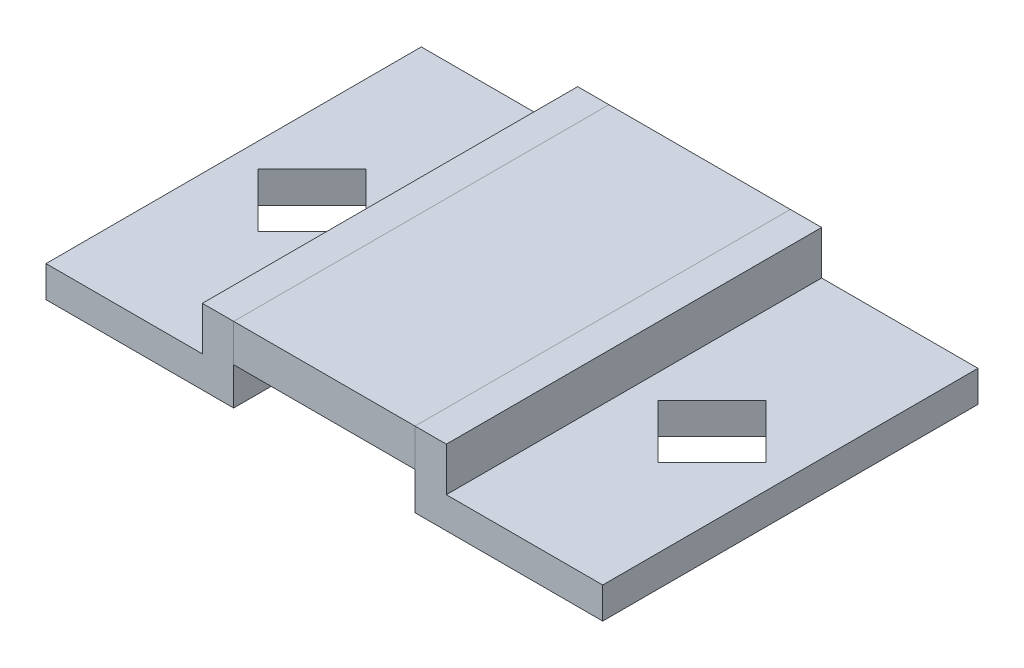
ISO-10303-21;
HEADER;
FILE_DESCRIPTION(('STEP AP214'),'2;1');
FILE_NAME('part.step','',(''),(''),'','','');
FILE_SCHEMA(('AUTOMOTIVE_DESIGN { 1 0 10303 214 1 1 1 1 }'));
ENDSEC;
DATA;
#1=APPLICATION_CONTEXT('core data for automotive mechanical design processes');
#2=APPLICATION_PROTOCOL_DEFINITION('international standard','automotive_design',2000,#1);
#3=PRODUCT_CONTEXT('',#1,'mechanical');
#4=PRODUCT('Part','Part','',(#3));
#5=PRODUCT_RELATED_PRODUCT_CATEGORY('part','',(#4));
#6=PRODUCT_DEFINITION_FORMATION('','',#4);
#7=PRODUCT_DEFINITION_CONTEXT('part definition',#1,'design');
#8=PRODUCT_DEFINITION('design','',#6,#7);
#9=PRODUCT_DEFINITION_SHAPE('','',#8);
#10=(LENGTH_UNIT() NAMED_UNIT(*) SI_UNIT(.MILLI.,.METRE.));
#11=(NAMED_UNIT(*) PLANE_ANGLE_UNIT() SI_UNIT($,.RADIAN.));
#12=(NAMED_UNIT(*) SI_UNIT($,.STERADIAN.) SOLID_ANGLE_UNIT());
#13=UNCERTAINTY_MEASURE_WITH_UNIT(LENGTH_MEASURE(1.E-05),#10,'distance_accuracy_value','');
#14=(GEOMETRIC_REPRESENTATION_CONTEXT(3) GLOBAL_UNCERTAINTY_ASSIGNED_CONTEXT((#13)) GLOBAL_UNIT_ASSIGNED_CONTEXT((#10,
#11,#12)) REPRESENTATION_CONTEXT('',''));
#15=CARTESIAN_POINT('',(0.,0.,0.));
#16=DIRECTION('',(0.,0.,1.));
#17=DIRECTION('',(1.,0.,0.));
#18=AXIS2_PLACEMENT_3D('',#15,#16,#17);
#19=CARTESIAN_POINT('',(17.,-3.,-30.));
#20=DIRECTION('',(1.,0.,0.));
#21=DIRECTION('',(0.,0.,-1.));
#22=AXIS2_PLACEMENT_3D('',#19,#20,#21);
#23=PLANE('',#22);
#24=DIRECTION('',(0.,1.,0.));
#25=VECTOR('',#24,1.);
#26=CARTESIAN_POINT('',(17.,-3.,0.));
#27=LINE('',#26,#25);
#28=CARTESIAN_POINT('',(17.,-0.5,0.));
#29=VERTEX_POINT('',#28);
#30=CARTESIAN_POINT('',(17.,3.,0.));
#31=VERTEX_POINT('',#30);
#32=EDGE_CURVE('E193',#29,#31,#27,.T.);
#33=ORIENTED_EDGE('',*,*,#32,.F.);
#34=DIRECTION('',(0.,0.,-1.));
#35=VECTOR('',#34,1.);
#36=CARTESIAN_POINT('',(17.,-0.5,-30.));
#37=LINE('',#36,#35);
#38=CARTESIAN_POINT('',(17.,-0.5,-30.));
#39=VERTEX_POINT('',#38);
#40=EDGE_CURVE('E179',#29,#39,#37,.T.);
#41=ORIENTED_EDGE('',*,*,#40,.T.);
#42=DIRECTION('',(0.,1.,0.));
#43=VECTOR('',#42,1.);
#44=CARTESIAN_POINT('',(17.,-3.,-30.));
#45=LINE('',#44,#43);
#46=CARTESIAN_POINT('',(17.,3.,-30.));
#47=VERTEX_POINT('',#46);
#48=EDGE_CURVE('E195',#39,#47,#45,.T.);
#49=ORIENTED_EDGE('',*,*,#48,.T.);
#50=DIRECTION('',(0.,0.,-1.));
#51=VECTOR('',#50,1.);
#52=CARTESIAN_POINT('',(17.,3.,-30.));
#53=LINE('',#52,#51);
#54=EDGE_CURVE('E201',#31,#47,#53,.T.);
#55=ORIENTED_EDGE('',*,*,#54,.F.);
#56=EDGE_LOOP('',(#33,#41,#49,#55));
#57=FACE_BOUND('',#56,.T.);
#58=ADVANCED_FACE('F54',(#57),#23,.T.);
#59=CARTESIAN_POINT('',(14.5,-3.,-30.));
#60=DIRECTION('',(-1.,0.,0.));
#61=DIRECTION('',(0.,0.,1.));
#62=AXIS2_PLACEMENT_3D('',#59,#60,#61);
#63=PLANE('',#62);
#64=DIRECTION('',(0.,0.,1.));
#65=VECTOR('',#64,1.);
#66=CARTESIAN_POINT('',(14.5,3.,-30.));
#67=LINE('',#66,#65);
#68=CARTESIAN_POINT('',(14.5,3.,-30.));
#69=VERTEX_POINT('',#68);
#70=CARTESIAN_POINT('',(14.5,3.,0.));
#71=VERTEX_POINT('',#70);
#72=EDGE_CURVE('E12',#69,#71,#67,.T.);
#73=ORIENTED_EDGE('',*,*,#72,.F.);
#74=DIRECTION('',(0.,1.,0.));
#75=VECTOR('',#74,1.);
#76=CARTESIAN_POINT('',(14.5,-3.,-30.));
#77=LINE('',#76,#75);
#78=CARTESIAN_POINT('',(14.5,-3.,-30.));
#79=VERTEX_POINT('',#78);
#80=EDGE_CURVE('E178',#79,#69,#77,.T.);
#81=ORIENTED_EDGE('',*,*,#80,.F.);
#82=DIRECTION('',(0.,0.,1.));
#83=VECTOR('',#82,1.);
#84=CARTESIAN_POINT('',(14.5,-3.,-30.));
#85=LINE('',#84,#83);
#86=CARTESIAN_POINT('',(14.5,-3.,0.));
#87=VERTEX_POINT('',#86);
#88=EDGE_CURVE('E58',#79,#87,#85,.T.);
#89=ORIENTED_EDGE('',*,*,#88,.T.);
#90=DIRECTION('',(0.,1.,0.));
#91=VECTOR('',#90,1.);
#92=CARTESIAN_POINT('',(14.5,-3.,0.));
#93=LINE('',#92,#91);
#94=EDGE_CURVE('E190',#87,#71,#93,.T.);
#95=ORIENTED_EDGE('',*,*,#94,.T.);
#96=EDGE_LOOP('',(#73,#81,#89,#95));
#97=FACE_BOUND('',#96,.T.);
#98=ADVANCED_FACE('F214',(#97),#63,.T.);
#99=CARTESIAN_POINT('',(14.5,-3.,-30.));
#100=DIRECTION('',(0.,0.,-1.));
#101=DIRECTION('',(-1.,0.,0.));
#102=AXIS2_PLACEMENT_3D('',#99,#100,#101);
#103=PLANE('',#102);
#104=DIRECTION('',(-1.,0.,0.));
#105=VECTOR('',#104,1.);
#106=CARTESIAN_POINT('',(14.5,3.,-30.));
#107=LINE('',#106,#105);
#108=EDGE_CURVE('E198',#47,#69,#107,.T.);
#109=ORIENTED_EDGE('',*,*,#108,.F.);
#110=ORIENTED_EDGE('',*,*,#48,.F.);
#111=DIRECTION('',(1.,0.,0.));
#112=VECTOR('',#111,1.);
#113=CARTESIAN_POINT('',(17.,-0.5,-30.));
#114=LINE('',#113,#112);
#115=CARTESIAN_POINT('',(29.5,-0.5,-30.));
#116=VERTEX_POINT('',#115);
#117=EDGE_CURVE('E185',#39,#116,#114,.T.);
#118=ORIENTED_EDGE('',*,*,#117,.T.);
#119=DIRECTION('',(0.,-1.,0.));
#120=VECTOR('',#119,1.);
#121=CARTESIAN_POINT('',(29.5,-0.5,-30.));
#122=LINE('',#121,#120);
#123=CARTESIAN_POINT('',(29.5,-3.,-30.));
#124=VERTEX_POINT('',#123);
#125=EDGE_CURVE('E169',#116,#124,#122,.T.);
#126=ORIENTED_EDGE('',*,*,#125,.T.);
#127=DIRECTION('',(-1.,0.,0.));
#128=VECTOR('',#127,1.);
#129=CARTESIAN_POINT('',(14.5,-3.,-30.));
#130=LINE('',#129,#128);
#131=EDGE_CURVE('E192',#124,#79,#130,.T.);
#132=ORIENTED_EDGE('',*,*,#131,.T.);
#133=ORIENTED_EDGE('',*,*,#80,.T.);
#134=EDGE_LOOP('',(#109,#110,#118,#126,#132,#133));
#135=FACE_BOUND('',#134,.T.);
#136=ADVANCED_FACE('F218',(#135),#103,.T.);
#137=CARTESIAN_POINT('',(14.5,-3.,0.));
#138=DIRECTION('',(0.,0.,1.));
#139=DIRECTION('',(1.,0.,0.));
#140=AXIS2_PLACEMENT_3D('',#137,#138,#139);
#141=PLANE('',#140);
#142=DIRECTION('',(1.,0.,0.));
#143=VECTOR('',#142,1.);
#144=CARTESIAN_POINT('',(14.5,3.,0.));
#145=LINE('',#144,#143);
#146=EDGE_CURVE('E63',#71,#31,#145,.T.);
#147=ORIENTED_EDGE('',*,*,#146,.F.);
#148=ORIENTED_EDGE('',*,*,#94,.F.);
#149=DIRECTION('',(1.,0.,0.));
#150=VECTOR('',#149,1.);
#151=CARTESIAN_POINT('',(14.5,-3.,0.));
#152=LINE('',#151,#150);
#153=CARTESIAN_POINT('',(29.5,-3.,0.));
#154=VERTEX_POINT('',#153);
#155=EDGE_CURVE('E207',#87,#154,#152,.T.);
#156=ORIENTED_EDGE('',*,*,#155,.T.);
#157=DIRECTION('',(0.,-1.,0.));
#158=VECTOR('',#157,1.);
#159=CARTESIAN_POINT('',(29.5,-0.5,0.));
#160=LINE('',#159,#158);
#161=CARTESIAN_POINT('',(29.5,-0.5,0.));
#162=VERTEX_POINT('',#161);
#163=EDGE_CURVE('E165',#162,#154,#160,.T.);
#164=ORIENTED_EDGE('',*,*,#163,.F.);
#165=DIRECTION('',(-1.,0.,0.));
#166=VECTOR('',#165,1.);
#167=CARTESIAN_POINT('',(17.,-0.5,0.));
#168=LINE('',#167,#166);
#169=EDGE_CURVE('E172',#162,#29,#168,.T.);
#170=ORIENTED_EDGE('',*,*,#169,.T.);
#171=ORIENTED_EDGE('',*,*,#32,.T.);
#172=EDGE_LOOP('',(#147,#148,#156,#164,#170,#171));
#173=FACE_BOUND('',#172,.T.);
#174=ADVANCED_FACE('F225',(#173),#141,.T.);
#175=CARTESIAN_POINT('',(0.,-3.,0.));
#176=DIRECTION('',(0.,1.,0.));
#177=DIRECTION('',(0.,0.,1.));
#178=AXIS2_PLACEMENT_3D('',#175,#176,#177);
#179=PLANE('',#178);
#180=DIRECTION('',(0.707106781186548,0.,0.707106781186547));
#181=VECTOR('',#180,1.);
#182=CARTESIAN_POINT('',(23.25,-3.,-10.6866486347621));
#183=LINE('',#182,#181);
#184=CARTESIAN_POINT('',(18.9366486347621,-3.,-15.));
#185=VERTEX_POINT('',#184);
#186=CARTESIAN_POINT('',(23.25,-3.,-10.6866486347621));
#187=VERTEX_POINT('',#186);
#188=EDGE_CURVE('E141',#185,#187,#183,.T.);
#189=ORIENTED_EDGE('',*,*,#188,.T.);
#190=DIRECTION('',(0.707106781186547,0.,-0.707106781186548));
#191=VECTOR('',#190,1.);
#192=CARTESIAN_POINT('',(27.5633513652379,-3.,-15.));
#193=LINE('',#192,#191);
#194=CARTESIAN_POINT('',(27.5633513652379,-3.,-15.));
#195=VERTEX_POINT('',#194);
#196=EDGE_CURVE('E135',#187,#195,#193,.T.);
#197=ORIENTED_EDGE('',*,*,#196,.T.);
#198=DIRECTION('',(-0.707106781186548,0.,-0.707106781186547));
#199=VECTOR('',#198,1.);
#200=CARTESIAN_POINT('',(23.25,-3.,-19.3133513652379));
#201=LINE('',#200,#199);
#202=CARTESIAN_POINT('',(23.25,-3.,-19.3133513652379));
#203=VERTEX_POINT('',#202);
#204=EDGE_CURVE('E144',#195,#203,#201,.T.);
#205=ORIENTED_EDGE('',*,*,#204,.T.);
#206=DIRECTION('',(-0.707106781186547,0.,0.707106781186547));
#207=VECTOR('',#206,1.);
#208=CARTESIAN_POINT('',(18.9366486347621,-3.,-15.));
#209=LINE('',#208,#207);
#210=EDGE_CURVE('E71',#203,#185,#209,.T.);
#211=ORIENTED_EDGE('',*,*,#210,.T.);
#212=EDGE_LOOP('',(#189,#197,#205,#211));
#213=FACE_BOUND('',#212,.T.);
#214=ORIENTED_EDGE('',*,*,#88,.F.);
#215=ORIENTED_EDGE('',*,*,#131,.F.);
#216=DIRECTION('',(0.,0.,1.));
#217=VECTOR('',#216,1.);
#218=CARTESIAN_POINT('',(29.5,-3.,-30.));
#219=LINE('',#218,#217);
#220=EDGE_CURVE('E175',#124,#154,#219,.T.);
#221=ORIENTED_EDGE('',*,*,#220,.T.);
#222=ORIENTED_EDGE('',*,*,#155,.F.);
#223=EDGE_LOOP('',(#214,#215,#221,#222));
#224=FACE_BOUND('',#223,.T.);
#225=ADVANCED_FACE('F56',(#213,#224),#179,.F.);
#226=CARTESIAN_POINT('',(0.,3.,0.));
#227=DIRECTION('',(0.,1.,0.));
#228=DIRECTION('',(0.,0.,1.));
#229=AXIS2_PLACEMENT_3D('',#226,#227,#228);
#230=PLANE('',#229);
#231=ORIENTED_EDGE('',*,*,#72,.T.);
#232=ORIENTED_EDGE('',*,*,#146,.T.);
#233=ORIENTED_EDGE('',*,*,#54,.T.);
#234=ORIENTED_EDGE('',*,*,#108,.T.);
#235=EDGE_LOOP('',(#231,#232,#233,#234));
#236=FACE_BOUND('',#235,.T.);
#237=ADVANCED_FACE('F231',(#236),#230,.T.);
#238=CARTESIAN_POINT('',(29.5,-0.5,-30.));
#239=DIRECTION('',(1.,0.,0.));
#240=DIRECTION('',(0.,0.,-1.));
#241=AXIS2_PLACEMENT_3D('',#238,#239,#240);
#242=PLANE('',#241);
#243=ORIENTED_EDGE('',*,*,#220,.F.);
#244=ORIENTED_EDGE('',*,*,#125,.F.);
#245=DIRECTION('',(0.,0.,1.));
#246=VECTOR('',#245,1.);
#247=CARTESIAN_POINT('',(29.5,-0.5,-30.));
#248=LINE('',#247,#246);
#249=EDGE_CURVE('E182',#116,#162,#248,.T.);
#250=ORIENTED_EDGE('',*,*,#249,.T.);
#251=ORIENTED_EDGE('',*,*,#163,.T.);
#252=EDGE_LOOP('',(#243,#244,#250,#251));
#253=FACE_BOUND('',#252,.T.);
#254=ADVANCED_FACE('F223',(#253),#242,.T.);
#255=CARTESIAN_POINT('',(0.,-0.5,0.));
#256=DIRECTION('',(0.,1.,0.));
#257=DIRECTION('',(0.,0.,1.));
#258=AXIS2_PLACEMENT_3D('',#255,#256,#257);
#259=PLANE('',#258);
#260=DIRECTION('',(0.707106781186547,0.,-0.707106781186548));
#261=VECTOR('',#260,1.);
#262=CARTESIAN_POINT('',(27.5633513652379,-0.5,-15.));
#263=LINE('',#262,#261);
#264=CARTESIAN_POINT('',(23.25,-0.5,-10.6866486347621));
#265=VERTEX_POINT('',#264);
#266=CARTESIAN_POINT('',(27.5633513652379,-0.5,-15.));
#267=VERTEX_POINT('',#266);
#268=EDGE_CURVE('E79',#265,#267,#263,.T.);
#269=ORIENTED_EDGE('',*,*,#268,.F.);
#270=DIRECTION('',(0.707106781186548,0.,0.707106781186547));
#271=VECTOR('',#270,1.);
#272=CARTESIAN_POINT('',(23.25,-0.5,-10.6866486347621));
#273=LINE('',#272,#271);
#274=CARTESIAN_POINT('',(18.9366486347621,-0.5,-15.));
#275=VERTEX_POINT('',#274);
#276=EDGE_CURVE('E150',#275,#265,#273,.T.);
#277=ORIENTED_EDGE('',*,*,#276,.F.);
#278=DIRECTION('',(-0.707106781186547,0.,0.707106781186547));
#279=VECTOR('',#278,1.);
#280=CARTESIAN_POINT('',(18.9366486347621,-0.5,-15.));
#281=LINE('',#280,#279);
#282=CARTESIAN_POINT('',(23.25,-0.5,-19.3133513652379));
#283=VERTEX_POINT('',#282);
#284=EDGE_CURVE('E153',#283,#275,#281,.T.);
#285=ORIENTED_EDGE('',*,*,#284,.F.);
#286=DIRECTION('',(-0.707106781186548,0.,-0.707106781186547));
#287=VECTOR('',#286,1.);
#288=CARTESIAN_POINT('',(23.25,-0.5,-19.3133513652379));
#289=LINE('',#288,#287);
#290=EDGE_CURVE('E159',#267,#283,#289,.T.);
#291=ORIENTED_EDGE('',*,*,#290,.F.);
#292=EDGE_LOOP('',(#269,#277,#285,#291));
#293=FACE_BOUND('',#292,.T.);
#294=ORIENTED_EDGE('',*,*,#40,.F.);
#295=ORIENTED_EDGE('',*,*,#169,.F.);
#296=ORIENTED_EDGE('',*,*,#249,.F.);
#297=ORIENTED_EDGE('',*,*,#117,.F.);
#298=EDGE_LOOP('',(#294,#295,#296,#297));
#299=FACE_BOUND('',#298,.T.);
#300=ADVANCED_FACE('F238',(#293,#299),#259,.T.);
#301=CARTESIAN_POINT('',(27.5633513652379,-3.,-15.));
#302=DIRECTION('',(0.707106781186548,0.,0.707106781186547));
#303=DIRECTION('',(0.707106781186547,0.,-0.707106781186548));
#304=AXIS2_PLACEMENT_3D('',#301,#302,#303);
#305=PLANE('',#304);
#306=ORIENTED_EDGE('',*,*,#268,.T.);
#307=DIRECTION('',(0.,1.,0.));
#308=VECTOR('',#307,1.);
#309=CARTESIAN_POINT('',(27.5633513652379,-3.,-15.));
#310=LINE('',#309,#308);
#311=EDGE_CURVE('E131',#195,#267,#310,.T.);
#312=ORIENTED_EDGE('',*,*,#311,.F.);
#313=ORIENTED_EDGE('',*,*,#196,.F.);
#314=DIRECTION('',(0.,1.,0.));
#315=VECTOR('',#314,1.);
#316=CARTESIAN_POINT('',(23.25,-3.,-10.6866486347621));
#317=LINE('',#316,#315);
#318=EDGE_CURVE('E163',#187,#265,#317,.T.);
#319=ORIENTED_EDGE('',*,*,#318,.T.);
#320=EDGE_LOOP('',(#306,#312,#313,#319));
#321=FACE_BOUND('',#320,.T.);
#322=ADVANCED_FACE('F133',(#321),#305,.F.);
#323=CARTESIAN_POINT('',(23.25,-3.,-10.6866486347621));
#324=DIRECTION('',(-0.707106781186547,0.,0.707106781186548));
#325=DIRECTION('',(0.707106781186548,0.,0.707106781186547));
#326=AXIS2_PLACEMENT_3D('',#323,#324,#325);
#327=PLANE('',#326);
#328=ORIENTED_EDGE('',*,*,#276,.T.);
#329=ORIENTED_EDGE('',*,*,#318,.F.);
#330=ORIENTED_EDGE('',*,*,#188,.F.);
#331=DIRECTION('',(0.,1.,0.));
#332=VECTOR('',#331,1.);
#333=CARTESIAN_POINT('',(18.9366486347621,-3.,-15.));
#334=LINE('',#333,#332);
#335=EDGE_CURVE('E166',#185,#275,#334,.T.);
#336=ORIENTED_EDGE('',*,*,#335,.T.);
#337=EDGE_LOOP('',(#328,#329,#330,#336));
#338=FACE_BOUND('',#337,.T.);
#339=ADVANCED_FACE('F278',(#338),#327,.F.);
#340=CARTESIAN_POINT('',(18.9366486347621,-3.,-15.));
#341=DIRECTION('',(-0.707106781186548,0.,-0.707106781186548));
#342=DIRECTION('',(-0.707106781186548,0.,0.707106781186548));
#343=AXIS2_PLACEMENT_3D('',#340,#341,#342);
#344=PLANE('',#343);
#345=ORIENTED_EDGE('',*,*,#284,.T.);
#346=ORIENTED_EDGE('',*,*,#335,.F.);
#347=ORIENTED_EDGE('',*,*,#210,.F.);
#348=DIRECTION('',(0.,1.,0.));
#349=VECTOR('',#348,1.);
#350=CARTESIAN_POINT('',(23.25,-3.,-19.3133513652379));
#351=LINE('',#350,#349);
#352=EDGE_CURVE('E140',#203,#283,#351,.T.);
#353=ORIENTED_EDGE('',*,*,#352,.T.);
#354=EDGE_LOOP('',(#345,#346,#347,#353));
#355=FACE_BOUND('',#354,.T.);
#356=ADVANCED_FACE('F286',(#355),#344,.F.);
#357=CARTESIAN_POINT('',(23.25,-3.,-19.3133513652379));
#358=DIRECTION('',(0.707106781186547,0.,-0.707106781186548));
#359=DIRECTION('',(-0.707106781186548,0.,-0.707106781186547));
#360=AXIS2_PLACEMENT_3D('',#357,#358,#359);
#361=PLANE('',#360);
#362=ORIENTED_EDGE('',*,*,#290,.T.);
#363=ORIENTED_EDGE('',*,*,#352,.F.);
#364=ORIENTED_EDGE('',*,*,#204,.F.);
#365=ORIENTED_EDGE('',*,*,#311,.T.);
#366=EDGE_LOOP('',(#362,#363,#364,#365));
#367=FACE_BOUND('',#366,.T.);
#368=ADVANCED_FACE('F145',(#367),#361,.F.);
#369=CLOSED_SHELL('',(#58,#98,#136,#174,#225,#237,#254,#300,#322,#339,#356,#368));
#370=MANIFOLD_SOLID_BREP('B2',#369);
#371=CARTESIAN_POINT('',(-2.5,-3.,-30.));
#372=DIRECTION('',(-1.,0.,0.));
#373=DIRECTION('',(0.,0.,1.));
#374=AXIS2_PLACEMENT_3D('',#371,#372,#373);
#375=PLANE('',#374);
#376=DIRECTION('',(0.,1.,0.));
#377=VECTOR('',#376,1.);
#378=CARTESIAN_POINT('',(-2.5,-3.,-30.));
#379=LINE('',#378,#377);
#380=CARTESIAN_POINT('',(-2.5,-0.5,-30.));
#381=VERTEX_POINT('',#380);
#382=CARTESIAN_POINT('',(-2.5,3.,-30.));
#383=VERTEX_POINT('',#382);
#384=EDGE_CURVE('E506',#381,#383,#379,.T.);
#385=ORIENTED_EDGE('',*,*,#384,.F.);
#386=DIRECTION('',(0.,0.,1.));
#387=VECTOR('',#386,1.);
#388=CARTESIAN_POINT('',(-2.5,-0.5,-30.));
#389=LINE('',#388,#387);
#390=CARTESIAN_POINT('',(-2.5,-0.5,0.));
#391=VERTEX_POINT('',#390);
#392=EDGE_CURVE('E456',#381,#391,#389,.T.);
#393=ORIENTED_EDGE('',*,*,#392,.T.);
#394=DIRECTION('',(0.,1.,0.));
#395=VECTOR('',#394,1.);
#396=CARTESIAN_POINT('',(-2.5,-3.,0.));
#397=LINE('',#396,#395);
#398=CARTESIAN_POINT('',(-2.5,3.,0.));
#399=VERTEX_POINT('',#398);
#400=EDGE_CURVE('E363',#391,#399,#397,.T.);
#401=ORIENTED_EDGE('',*,*,#400,.T.);
#402=DIRECTION('',(0.,0.,1.));
#403=VECTOR('',#402,1.);
#404=CARTESIAN_POINT('',(-2.5,3.,-30.));
#405=LINE('',#404,#403);
#406=EDGE_CURVE('E501',#383,#399,#405,.T.);
#407=ORIENTED_EDGE('',*,*,#406,.F.);
#408=EDGE_LOOP('',(#385,#393,#401,#407));
#409=FACE_BOUND('',#408,.T.);
#410=ADVANCED_FACE('F354',(#409),#375,.T.);
#411=CARTESIAN_POINT('',(0.,-3.,-30.));
#412=DIRECTION('',(1.,0.,0.));
#413=DIRECTION('',(0.,0.,-1.));
#414=AXIS2_PLACEMENT_3D('',#411,#412,#413);
#415=PLANE('',#414);
#416=DIRECTION('',(0.,0.,-1.));
#417=VECTOR('',#416,1.);
#418=CARTESIAN_POINT('',(0.,3.,-30.));
#419=LINE('',#418,#417);
#420=CARTESIAN_POINT('',(0.,3.,0.));
#421=VERTEX_POINT('',#420);
#422=CARTESIAN_POINT('',(0.,3.,-30.));
#423=VERTEX_POINT('',#422);
#424=EDGE_CURVE('E484',#421,#423,#419,.T.);
#425=ORIENTED_EDGE('',*,*,#424,.F.);
#426=DIRECTION('',(0.,1.,0.));
#427=VECTOR('',#426,1.);
#428=CARTESIAN_POINT('',(0.,-3.,0.));
#429=LINE('',#428,#427);
#430=CARTESIAN_POINT('',(0.,-3.,0.));
#431=VERTEX_POINT('',#430);
#432=EDGE_CURVE('E52',#431,#421,#429,.T.);
#433=ORIENTED_EDGE('',*,*,#432,.F.);
#434=DIRECTION('',(0.,0.,-1.));
#435=VECTOR('',#434,1.);
#436=CARTESIAN_POINT('',(0.,-3.,-30.));
#437=LINE('',#436,#435);
#438=CARTESIAN_POINT('',(0.,-3.,-30.));
#439=VERTEX_POINT('',#438);
#440=EDGE_CURVE('E487',#431,#439,#437,.T.);
#441=ORIENTED_EDGE('',*,*,#440,.T.);
#442=DIRECTION('',(0.,1.,0.));
#443=VECTOR('',#442,1.);
#444=CARTESIAN_POINT('',(0.,-3.,-30.));
#445=LINE('',#444,#443);
#446=EDGE_CURVE('E358',#439,#423,#445,.T.);
#447=ORIENTED_EDGE('',*,*,#446,.T.);
#448=EDGE_LOOP('',(#425,#433,#441,#447));
#449=FACE_BOUND('',#448,.T.);
#450=ADVANCED_FACE('F356',(#449),#415,.T.);
#451=CARTESIAN_POINT('',(0.,-3.,0.));
#452=DIRECTION('',(0.,0.,1.));
#453=DIRECTION('',(1.,0.,0.));
#454=AXIS2_PLACEMENT_3D('',#451,#452,#453);
#455=PLANE('',#454);
#456=DIRECTION('',(1.,0.,0.));
#457=VECTOR('',#456,1.);
#458=CARTESIAN_POINT('',(0.,3.,0.));
#459=LINE('',#458,#457);
#460=EDGE_CURVE('E491',#399,#421,#459,.T.);
#461=ORIENTED_EDGE('',*,*,#460,.F.);
#462=ORIENTED_EDGE('',*,*,#400,.F.);
#463=DIRECTION('',(-1.,0.,0.));
#464=VECTOR('',#463,1.);
#465=CARTESIAN_POINT('',(-2.5,-0.5,0.));
#466=LINE('',#465,#464);
#467=CARTESIAN_POINT('',(-15.,-0.5,0.));
#468=VERTEX_POINT('',#467);
#469=EDGE_CURVE('E471',#391,#468,#466,.T.);
#470=ORIENTED_EDGE('',*,*,#469,.T.);
#471=DIRECTION('',(0.,-1.,0.));
#472=VECTOR('',#471,1.);
#473=CARTESIAN_POINT('',(-15.,-0.5,0.));
#474=LINE('',#473,#472);
#475=CARTESIAN_POINT('',(-15.,-3.,0.));
#476=VERTEX_POINT('',#475);
#477=EDGE_CURVE('E479',#468,#476,#474,.T.);
#478=ORIENTED_EDGE('',*,*,#477,.T.);
#479=DIRECTION('',(1.,0.,0.));
#480=VECTOR('',#479,1.);
#481=CARTESIAN_POINT('',(0.,-3.,0.));
#482=LINE('',#481,#480);
#483=EDGE_CURVE('E493',#476,#431,#482,.T.);
#484=ORIENTED_EDGE('',*,*,#483,.T.);
#485=ORIENTED_EDGE('',*,*,#432,.T.);
#486=EDGE_LOOP('',(#461,#462,#470,#478,#484,#485));
#487=FACE_BOUND('',#486,.T.);
#488=ADVANCED_FACE('F521',(#487),#455,.T.);
#489=CARTESIAN_POINT('',(0.,-3.,-30.));
#490=DIRECTION('',(0.,0.,-1.));
#491=DIRECTION('',(-1.,0.,0.));
#492=AXIS2_PLACEMENT_3D('',#489,#490,#491);
#493=PLANE('',#492);
#494=DIRECTION('',(-1.,0.,0.));
#495=VECTOR('',#494,1.);
#496=CARTESIAN_POINT('',(0.,3.,-30.));
#497=LINE('',#496,#495);
#498=EDGE_CURVE('E498',#423,#383,#497,.T.);
#499=ORIENTED_EDGE('',*,*,#498,.F.);
#500=ORIENTED_EDGE('',*,*,#446,.F.);
#501=DIRECTION('',(-1.,0.,0.));
#502=VECTOR('',#501,1.);
#503=CARTESIAN_POINT('',(0.,-3.,-30.));
#504=LINE('',#503,#502);
#505=CARTESIAN_POINT('',(-15.,-3.,-30.));
#506=VERTEX_POINT('',#505);
#507=EDGE_CURVE('E490',#439,#506,#504,.T.);
#508=ORIENTED_EDGE('',*,*,#507,.T.);
#509=DIRECTION('',(0.,-1.,0.));
#510=VECTOR('',#509,1.);
#511=CARTESIAN_POINT('',(-15.,-0.5,-30.));
#512=LINE('',#511,#510);
#513=CARTESIAN_POINT('',(-15.,-0.5,-30.));
#514=VERTEX_POINT('',#513);
#515=EDGE_CURVE('E481',#514,#506,#512,.T.);
#516=ORIENTED_EDGE('',*,*,#515,.F.);
#517=DIRECTION('',(1.,0.,0.));
#518=VECTOR('',#517,1.);
#519=CARTESIAN_POINT('',(-2.5,-0.5,-30.));
#520=LINE('',#519,#518);
#521=EDGE_CURVE('E477',#514,#381,#520,.T.);
#522=ORIENTED_EDGE('',*,*,#521,.T.);
#523=ORIENTED_EDGE('',*,*,#384,.T.);
#524=EDGE_LOOP('',(#499,#500,#508,#516,#522,#523));
#525=FACE_BOUND('',#524,.T.);
#526=ADVANCED_FACE('F515',(#525),#493,.T.);
#527=CARTESIAN_POINT('',(0.,-3.,0.));
#528=DIRECTION('',(0.,-1.,0.));
#529=DIRECTION('',(0.,0.,-1.));
#530=AXIS2_PLACEMENT_3D('',#527,#528,#529);
#531=PLANE('',#530);
#532=DIRECTION('',(-0.707106781186548,0.,-0.707106781186547));
#533=VECTOR('',#532,1.);
#534=CARTESIAN_POINT('',(-4.43664863476206,-3.,-15.));
#535=LINE('',#534,#533);
#536=CARTESIAN_POINT('',(-4.43664863476206,-3.,-15.));
#537=VERTEX_POINT('',#536);
#538=CARTESIAN_POINT('',(-8.75,-3.,-19.3133513652379));
#539=VERTEX_POINT('',#538);
#540=EDGE_CURVE('E434',#537,#539,#535,.T.);
#541=ORIENTED_EDGE('',*,*,#540,.T.);
#542=DIRECTION('',(-0.707106781186547,0.,0.707106781186547));
#543=VECTOR('',#542,1.);
#544=CARTESIAN_POINT('',(-8.75,-3.,-19.3133513652379));
#545=LINE('',#544,#543);
#546=CARTESIAN_POINT('',(-13.0633513652379,-3.,-15.));
#547=VERTEX_POINT('',#546);
#548=EDGE_CURVE('E465',#539,#547,#545,.T.);
#549=ORIENTED_EDGE('',*,*,#548,.T.);
#550=DIRECTION('',(0.707106781186548,0.,0.707106781186547));
#551=VECTOR('',#550,1.);
#552=CARTESIAN_POINT('',(-13.0633513652379,-3.,-15.));
#553=LINE('',#552,#551);
#554=CARTESIAN_POINT('',(-8.75,-3.,-10.6866486347621));
#555=VERTEX_POINT('',#554);
#556=EDGE_CURVE('E371',#547,#555,#553,.T.);
#557=ORIENTED_EDGE('',*,*,#556,.T.);
#558=DIRECTION('',(0.707106781186548,0.,-0.707106781186547));
#559=VECTOR('',#558,1.);
#560=CARTESIAN_POINT('',(-8.75,-3.,-10.6866486347621));
#561=LINE('',#560,#559);
#562=EDGE_CURVE('E461',#555,#537,#561,.T.);
#563=ORIENTED_EDGE('',*,*,#562,.T.);
#564=EDGE_LOOP('',(#541,#549,#557,#563));
#565=FACE_BOUND('',#564,.T.);
#566=ORIENTED_EDGE('',*,*,#440,.F.);
#567=ORIENTED_EDGE('',*,*,#483,.F.);
#568=DIRECTION('',(0.,0.,-1.));
#569=VECTOR('',#568,1.);
#570=CARTESIAN_POINT('',(-15.,-3.,-30.));
#571=LINE('',#570,#569);
#572=EDGE_CURVE('E453',#476,#506,#571,.T.);
#573=ORIENTED_EDGE('',*,*,#572,.T.);
#574=ORIENTED_EDGE('',*,*,#507,.F.);
#575=EDGE_LOOP('',(#566,#567,#573,#574));
#576=FACE_BOUND('',#575,.T.);
#577=ADVANCED_FACE('F523',(#565,#576),#531,.T.);
#578=CARTESIAN_POINT('',(0.,3.,0.));
#579=DIRECTION('',(0.,-1.,0.));
#580=DIRECTION('',(0.,0.,-1.));
#581=AXIS2_PLACEMENT_3D('',#578,#579,#580);
#582=PLANE('',#581);
#583=ORIENTED_EDGE('',*,*,#424,.T.);
#584=ORIENTED_EDGE('',*,*,#498,.T.);
#585=ORIENTED_EDGE('',*,*,#406,.T.);
#586=ORIENTED_EDGE('',*,*,#460,.T.);
#587=EDGE_LOOP('',(#583,#584,#585,#586));
#588=FACE_BOUND('',#587,.T.);
#589=ADVANCED_FACE('F517',(#588),#582,.F.);
#590=CARTESIAN_POINT('',(-15.,-0.5,-30.));
#591=DIRECTION('',(-1.,0.,0.));
#592=DIRECTION('',(0.,0.,1.));
#593=AXIS2_PLACEMENT_3D('',#590,#591,#592);
#594=PLANE('',#593);
#595=ORIENTED_EDGE('',*,*,#572,.F.);
#596=ORIENTED_EDGE('',*,*,#477,.F.);
#597=DIRECTION('',(0.,0.,-1.));
#598=VECTOR('',#597,1.);
#599=CARTESIAN_POINT('',(-15.,-0.5,-30.));
#600=LINE('',#599,#598);
#601=EDGE_CURVE('E474',#468,#514,#600,.T.);
#602=ORIENTED_EDGE('',*,*,#601,.T.);
#603=ORIENTED_EDGE('',*,*,#515,.T.);
#604=EDGE_LOOP('',(#595,#596,#602,#603));
#605=FACE_BOUND('',#604,.T.);
#606=ADVANCED_FACE('F526',(#605),#594,.T.);
#607=CARTESIAN_POINT('',(0.,-0.5,0.));
#608=DIRECTION('',(0.,-1.,0.));
#609=DIRECTION('',(0.,0.,-1.));
#610=AXIS2_PLACEMENT_3D('',#607,#608,#609);
#611=PLANE('',#610);
#612=DIRECTION('',(-0.707106781186547,0.,0.707106781186547));
#613=VECTOR('',#612,1.);
#614=CARTESIAN_POINT('',(-8.75,-0.5,-19.3133513652379));
#615=LINE('',#614,#613);
#616=CARTESIAN_POINT('',(-8.75,-0.5,-19.3133513652379));
#617=VERTEX_POINT('',#616);
#618=CARTESIAN_POINT('',(-13.0633513652379,-0.5,-15.));
#619=VERTEX_POINT('',#618);
#620=EDGE_CURVE('E452',#617,#619,#615,.T.);
#621=ORIENTED_EDGE('',*,*,#620,.F.);
#622=DIRECTION('',(-0.707106781186548,0.,-0.707106781186547));
#623=VECTOR('',#622,1.);
#624=CARTESIAN_POINT('',(-4.43664863476206,-0.5,-15.));
#625=LINE('',#624,#623);
#626=CARTESIAN_POINT('',(-4.43664863476206,-0.5,-15.));
#627=VERTEX_POINT('',#626);
#628=EDGE_CURVE('E379',#627,#617,#625,.T.);
#629=ORIENTED_EDGE('',*,*,#628,.F.);
#630=DIRECTION('',(0.707106781186548,0.,-0.707106781186547));
#631=VECTOR('',#630,1.);
#632=CARTESIAN_POINT('',(-8.75,-0.5,-10.6866486347621));
#633=LINE('',#632,#631);
#634=CARTESIAN_POINT('',(-8.75,-0.5,-10.6866486347621));
#635=VERTEX_POINT('',#634);
#636=EDGE_CURVE('E441',#635,#627,#633,.T.);
#637=ORIENTED_EDGE('',*,*,#636,.F.);
#638=DIRECTION('',(0.707106781186548,0.,0.707106781186547));
#639=VECTOR('',#638,1.);
#640=CARTESIAN_POINT('',(-13.0633513652379,-0.5,-15.));
#641=LINE('',#640,#639);
#642=EDGE_CURVE('E446',#619,#635,#641,.T.);
#643=ORIENTED_EDGE('',*,*,#642,.F.);
#644=EDGE_LOOP('',(#621,#629,#637,#643));
#645=FACE_BOUND('',#644,.T.);
#646=ORIENTED_EDGE('',*,*,#392,.F.);
#647=ORIENTED_EDGE('',*,*,#521,.F.);
#648=ORIENTED_EDGE('',*,*,#601,.F.);
#649=ORIENTED_EDGE('',*,*,#469,.F.);
#650=EDGE_LOOP('',(#646,#647,#648,#649));
#651=FACE_BOUND('',#650,.T.);
#652=ADVANCED_FACE('F449',(#645,#651),#611,.F.);
#653=CARTESIAN_POINT('',(-4.43664863476206,-3.,-15.));
#654=DIRECTION('',(0.707106781186547,0.,-0.707106781186548));
#655=DIRECTION('',(-0.707106781186548,0.,-0.707106781186547));
#656=AXIS2_PLACEMENT_3D('',#653,#654,#655);
#657=PLANE('',#656);
#658=ORIENTED_EDGE('',*,*,#628,.T.);
#659=DIRECTION('',(0.,1.,0.));
#660=VECTOR('',#659,1.);
#661=CARTESIAN_POINT('',(-8.75,-3.,-19.3133513652379));
#662=LINE('',#661,#660);
#663=EDGE_CURVE('E463',#539,#617,#662,.T.);
#664=ORIENTED_EDGE('',*,*,#663,.F.);
#665=ORIENTED_EDGE('',*,*,#540,.F.);
#666=DIRECTION('',(0.,1.,0.));
#667=VECTOR('',#666,1.);
#668=CARTESIAN_POINT('',(-4.43664863476206,-3.,-15.));
#669=LINE('',#668,#667);
#670=EDGE_CURVE('E430',#537,#627,#669,.T.);
#671=ORIENTED_EDGE('',*,*,#670,.T.);
#672=EDGE_LOOP('',(#658,#664,#665,#671));
#673=FACE_BOUND('',#672,.T.);
#674=ADVANCED_FACE('F432',(#673),#657,.F.);
#675=CARTESIAN_POINT('',(-8.75,-3.,-10.6866486347621));
#676=DIRECTION('',(0.707106781186547,0.,0.707106781186548));
#677=DIRECTION('',(0.707106781186548,0.,-0.707106781186547));
#678=AXIS2_PLACEMENT_3D('',#675,#676,#677);
#679=PLANE('',#678);
#680=ORIENTED_EDGE('',*,*,#636,.T.);
#681=ORIENTED_EDGE('',*,*,#670,.F.);
#682=ORIENTED_EDGE('',*,*,#562,.F.);
#683=DIRECTION('',(0.,1.,0.));
#684=VECTOR('',#683,1.);
#685=CARTESIAN_POINT('',(-8.75,-3.,-10.6866486347621));
#686=LINE('',#685,#684);
#687=EDGE_CURVE('E438',#555,#635,#686,.T.);
#688=ORIENTED_EDGE('',*,*,#687,.T.);
#689=EDGE_LOOP('',(#680,#681,#682,#688));
#690=FACE_BOUND('',#689,.T.);
#691=ADVANCED_FACE('F442',(#690),#679,.F.);
#692=CARTESIAN_POINT('',(-13.0633513652379,-3.,-15.));
#693=DIRECTION('',(-0.707106781186547,0.,0.707106781186548));
#694=DIRECTION('',(0.707106781186548,0.,0.707106781186547));
#695=AXIS2_PLACEMENT_3D('',#692,#693,#694);
#696=PLANE('',#695);
#697=ORIENTED_EDGE('',*,*,#642,.T.);
#698=ORIENTED_EDGE('',*,*,#687,.F.);
#699=ORIENTED_EDGE('',*,*,#556,.F.);
#700=DIRECTION('',(0.,1.,0.));
#701=VECTOR('',#700,1.);
#702=CARTESIAN_POINT('',(-13.0633513652379,-3.,-15.));
#703=LINE('',#702,#701);
#704=EDGE_CURVE('E638',#547,#619,#703,.T.);
#705=ORIENTED_EDGE('',*,*,#704,.T.);
#706=EDGE_LOOP('',(#697,#698,#699,#705));
#707=FACE_BOUND('',#706,.T.);
#708=ADVANCED_FACE('F602',(#707),#696,.F.);
#709=CARTESIAN_POINT('',(-8.75,-3.,-19.3133513652379));
#710=DIRECTION('',(-0.707106781186548,0.,-0.707106781186548));
#711=DIRECTION('',(-0.707106781186548,0.,0.707106781186548));
#712=AXIS2_PLACEMENT_3D('',#709,#710,#711);
#713=PLANE('',#712);
#714=ORIENTED_EDGE('',*,*,#620,.T.);
#715=ORIENTED_EDGE('',*,*,#704,.F.);
#716=ORIENTED_EDGE('',*,*,#548,.F.);
#717=ORIENTED_EDGE('',*,*,#663,.T.);
#718=EDGE_LOOP('',(#714,#715,#716,#717));
#719=FACE_BOUND('',#718,.T.);
#720=ADVANCED_FACE('F611',(#719),#713,.F.);
#721=CLOSED_SHELL('',(#410,#450,#488,#526,#577,#589,#606,#652,#674,#691,#708,#720));
#722=MANIFOLD_SOLID_BREP('B6',#721);
#723=CARTESIAN_POINT('',(0.,3.,0.));
#724=DIRECTION('',(0.,0.,-1.));
#725=DIRECTION('',(-1.,0.,0.));
#726=AXIS2_PLACEMENT_3D('',#723,#724,#725);
#727=PLANE('',#726);
#728=DIRECTION('',(1.,0.,0.));
#729=VECTOR('',#728,1.);
#730=CARTESIAN_POINT('',(0.,0.,0.));
#731=LINE('',#730,#729);
#732=CARTESIAN_POINT('',(0.,0.,0.));
#733=VERTEX_POINT('',#732);
#734=CARTESIAN_POINT('',(14.5,0.,0.));
#735=VERTEX_POINT('',#734);
#736=EDGE_CURVE('E708',#733,#735,#731,.T.);
#737=ORIENTED_EDGE('',*,*,#736,.T.);
#738=DIRECTION('',(0.,-1.,0.));
#739=VECTOR('',#738,1.);
#740=CARTESIAN_POINT('',(14.5,3.,0.));
#741=LINE('',#740,#739);
#742=CARTESIAN_POINT('',(14.5,3.,0.));
#743=VERTEX_POINT('',#742);
#744=EDGE_CURVE('E352',#743,#735,#741,.T.);
#745=ORIENTED_EDGE('',*,*,#744,.F.);
#746=DIRECTION('',(1.,0.,0.));
#747=VECTOR('',#746,1.);
#748=CARTESIAN_POINT('',(0.,3.,0.));
#749=LINE('',#748,#747);
#750=CARTESIAN_POINT('',(0.,3.,0.));
#751=VERTEX_POINT('',#750);
#752=EDGE_CURVE('E694',#751,#743,#749,.T.);
#753=ORIENTED_EDGE('',*,*,#752,.F.);
#754=DIRECTION('',(0.,-1.,0.));
#755=VECTOR('',#754,1.);
#756=CARTESIAN_POINT('',(0.,3.,0.));
#757=LINE('',#756,#755);
#758=EDGE_CURVE('E661',#751,#733,#757,.T.);
#759=ORIENTED_EDGE('',*,*,#758,.T.);
#760=EDGE_LOOP('',(#737,#745,#753,#759));
#761=FACE_BOUND('',#760,.T.);
#762=ADVANCED_FACE('F645',(#761),#727,.F.);
#763=CARTESIAN_POINT('',(14.5,3.,0.));
#764=DIRECTION('',(-1.,0.,0.));
#765=DIRECTION('',(0.,0.,1.));
#766=AXIS2_PLACEMENT_3D('',#763,#764,#765);
#767=PLANE('',#766);
#768=DIRECTION('',(0.,0.,-1.));
#769=VECTOR('',#768,1.);
#770=CARTESIAN_POINT('',(14.5,0.,0.));
#771=LINE('',#770,#769);
#772=CARTESIAN_POINT('',(14.5,0.,-30.));
#773=VERTEX_POINT('',#772);
#774=EDGE_CURVE('E699',#735,#773,#771,.T.);
#775=ORIENTED_EDGE('',*,*,#774,.T.);
#776=DIRECTION('',(0.,-1.,0.));
#777=VECTOR('',#776,1.);
#778=CARTESIAN_POINT('',(14.5,3.,-30.));
#779=LINE('',#778,#777);
#780=CARTESIAN_POINT('',(14.5,3.,-30.));
#781=VERTEX_POINT('',#780);
#782=EDGE_CURVE('E653',#781,#773,#779,.T.);
#783=ORIENTED_EDGE('',*,*,#782,.F.);
#784=DIRECTION('',(0.,0.,-1.));
#785=VECTOR('',#784,1.);
#786=CARTESIAN_POINT('',(14.5,3.,0.));
#787=LINE('',#786,#785);
#788=EDGE_CURVE('E686',#743,#781,#787,.T.);
#789=ORIENTED_EDGE('',*,*,#788,.F.);
#790=ORIENTED_EDGE('',*,*,#744,.T.);
#791=EDGE_LOOP('',(#775,#783,#789,#790));
#792=FACE_BOUND('',#791,.T.);
#793=ADVANCED_FACE('F698',(#792),#767,.F.);
#794=CARTESIAN_POINT('',(0.,3.,-30.));
#795=DIRECTION('',(0.,0.,-1.));
#796=DIRECTION('',(-1.,0.,0.));
#797=AXIS2_PLACEMENT_3D('',#794,#795,#796);
#798=PLANE('',#797);
#799=DIRECTION('',(1.,0.,0.));
#800=VECTOR('',#799,1.);
#801=CARTESIAN_POINT('',(0.,0.,-30.));
#802=LINE('',#801,#800);
#803=CARTESIAN_POINT('',(0.,0.,-30.));
#804=VERTEX_POINT('',#803);
#805=EDGE_CURVE('E711',#804,#773,#802,.T.);
#806=ORIENTED_EDGE('',*,*,#805,.F.);
#807=DIRECTION('',(0.,-1.,0.));
#808=VECTOR('',#807,1.);
#809=CARTESIAN_POINT('',(0.,3.,-30.));
#810=LINE('',#809,#808);
#811=CARTESIAN_POINT('',(0.,3.,-30.));
#812=VERTEX_POINT('',#811);
#813=EDGE_CURVE('E675',#812,#804,#810,.T.);
#814=ORIENTED_EDGE('',*,*,#813,.F.);
#815=DIRECTION('',(1.,0.,0.));
#816=VECTOR('',#815,1.);
#817=CARTESIAN_POINT('',(0.,3.,-30.));
#818=LINE('',#817,#816);
#819=EDGE_CURVE('E693',#812,#781,#818,.T.);
#820=ORIENTED_EDGE('',*,*,#819,.T.);
#821=ORIENTED_EDGE('',*,*,#782,.T.);
#822=EDGE_LOOP('',(#806,#814,#820,#821));
#823=FACE_BOUND('',#822,.T.);
#824=ADVANCED_FACE('F702',(#823),#798,.T.);
#825=CARTESIAN_POINT('',(0.,3.,0.));
#826=DIRECTION('',(-1.,0.,0.));
#827=DIRECTION('',(0.,0.,1.));
#828=AXIS2_PLACEMENT_3D('',#825,#826,#827);
#829=PLANE('',#828);
#830=DIRECTION('',(0.,0.,-1.));
#831=VECTOR('',#830,1.);
#832=CARTESIAN_POINT('',(0.,0.,0.));
#833=LINE('',#832,#831);
#834=EDGE_CURVE('E713',#733,#804,#833,.T.);
#835=ORIENTED_EDGE('',*,*,#834,.F.);
#836=ORIENTED_EDGE('',*,*,#758,.F.);
#837=DIRECTION('',(0.,0.,-1.));
#838=VECTOR('',#837,1.);
#839=CARTESIAN_POINT('',(0.,3.,0.));
#840=LINE('',#839,#838);
#841=EDGE_CURVE('E703',#751,#812,#840,.T.);
#842=ORIENTED_EDGE('',*,*,#841,.T.);
#843=ORIENTED_EDGE('',*,*,#813,.T.);
#844=EDGE_LOOP('',(#835,#836,#842,#843));
#845=FACE_BOUND('',#844,.T.);
#846=ADVANCED_FACE('F719',(#845),#829,.T.);
#847=CARTESIAN_POINT('',(0.,3.,0.));
#848=DIRECTION('',(0.,1.,0.));
#849=DIRECTION('',(0.,0.,1.));
#850=AXIS2_PLACEMENT_3D('',#847,#848,#849);
#851=PLANE('',#850);
#852=ORIENTED_EDGE('',*,*,#752,.T.);
#853=ORIENTED_EDGE('',*,*,#788,.T.);
#854=ORIENTED_EDGE('',*,*,#819,.F.);
#855=ORIENTED_EDGE('',*,*,#841,.F.);
#856=EDGE_LOOP('',(#852,#853,#854,#855));
#857=FACE_BOUND('',#856,.T.);
#858=ADVANCED_FACE('F690',(#857),#851,.T.);
#859=CARTESIAN_POINT('',(0.,0.,0.));
#860=DIRECTION('',(0.,1.,0.));
#861=DIRECTION('',(0.,0.,1.));
#862=AXIS2_PLACEMENT_3D('',#859,#860,#861);
#863=PLANE('',#862);
#864=ORIENTED_EDGE('',*,*,#736,.F.);
#865=ORIENTED_EDGE('',*,*,#834,.T.);
#866=ORIENTED_EDGE('',*,*,#805,.T.);
#867=ORIENTED_EDGE('',*,*,#774,.F.);
#868=EDGE_LOOP('',(#864,#865,#866,#867));
#869=FACE_BOUND('',#868,.T.);
#870=ADVANCED_FACE('F718',(#869),#863,.F.);
#871=CLOSED_SHELL('',(#762,#793,#824,#846,#858,#870));
#872=MANIFOLD_SOLID_BREP('B46',#871);
#873=ADVANCED_BREP_SHAPE_REPRESENTATION('',(#18,#370,#722,#872),#14);
#874=SHAPE_DEFINITION_REPRESENTATION(#9,#873);
ENDSEC;
END-ISO-10303-21;
